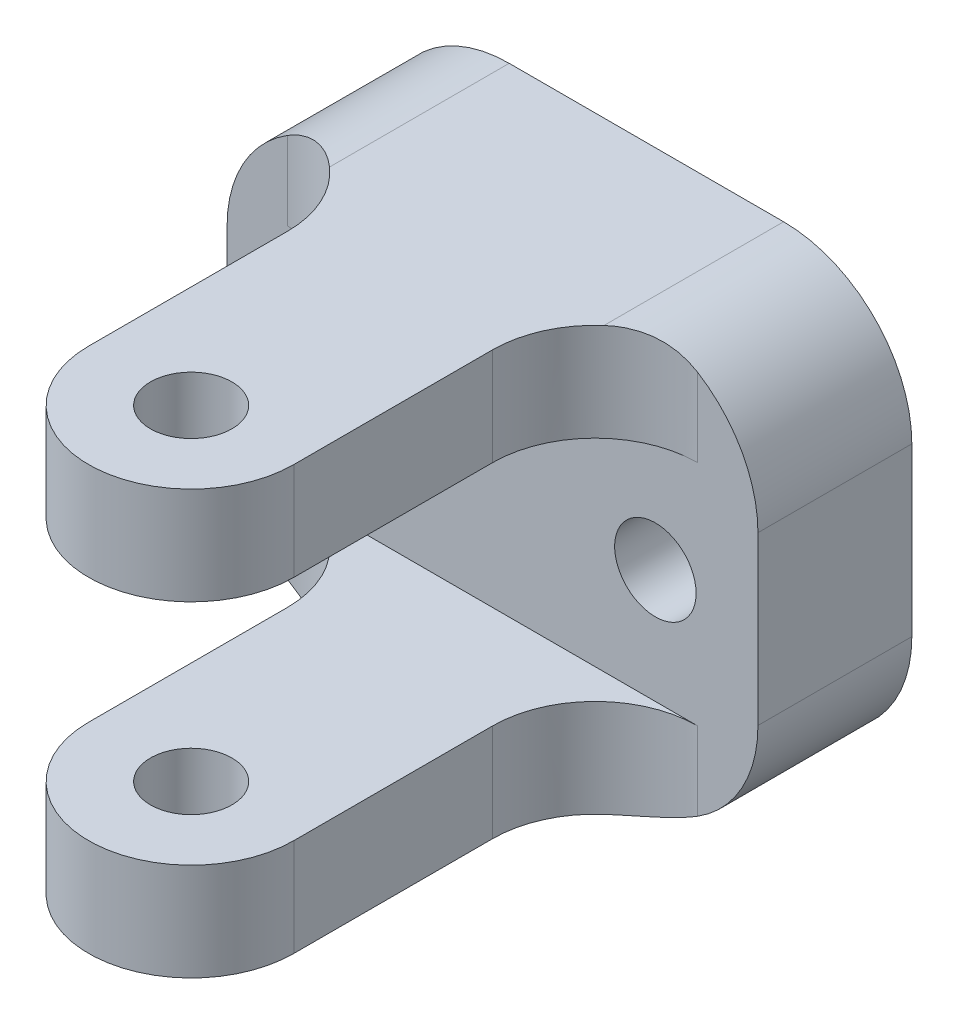
ISO-10303-21;
HEADER;
FILE_DESCRIPTION(('STEP AP214'),'2;1');
FILE_NAME('part.step','',(''),(''),'','','');
FILE_SCHEMA(('AUTOMOTIVE_DESIGN { 1 0 10303 214 1 1 1 1 }'));
ENDSEC;
DATA;
#1=APPLICATION_CONTEXT('core data for automotive mechanical design processes');
#2=APPLICATION_PROTOCOL_DEFINITION('international standard','automotive_design',2000,#1);
#3=PRODUCT_CONTEXT('',#1,'mechanical');
#4=PRODUCT('Part','Part','',(#3));
#5=PRODUCT_RELATED_PRODUCT_CATEGORY('part','',(#4));
#6=PRODUCT_DEFINITION_FORMATION('','',#4);
#7=PRODUCT_DEFINITION_CONTEXT('part definition',#1,'design');
#8=PRODUCT_DEFINITION('design','',#6,#7);
#9=PRODUCT_DEFINITION_SHAPE('','',#8);
#10=(LENGTH_UNIT() NAMED_UNIT(*) SI_UNIT(.MILLI.,.METRE.));
#11=(NAMED_UNIT(*) PLANE_ANGLE_UNIT() SI_UNIT($,.RADIAN.));
#12=(NAMED_UNIT(*) SI_UNIT($,.STERADIAN.) SOLID_ANGLE_UNIT());
#13=UNCERTAINTY_MEASURE_WITH_UNIT(LENGTH_MEASURE(1.E-05),#10,'distance_accuracy_value','');
#14=(GEOMETRIC_REPRESENTATION_CONTEXT(3) GLOBAL_UNCERTAINTY_ASSIGNED_CONTEXT((#13)) GLOBAL_UNIT_ASSIGNED_CONTEXT((#10,
#11,#12)) REPRESENTATION_CONTEXT('',''));
#15=CARTESIAN_POINT('',(0.,0.,0.));
#16=DIRECTION('',(0.,0.,1.));
#17=DIRECTION('',(1.,0.,0.));
#18=AXIS2_PLACEMENT_3D('',#15,#16,#17);
#19=CARTESIAN_POINT('',(0.,0.,12.));
#20=DIRECTION('',(0.,0.,-1.));
#21=DIRECTION('',(-1.,0.,0.));
#22=AXIS2_PLACEMENT_3D('',#19,#20,#21);
#23=PLANE('',#22);
#24=DIRECTION('',(0.,-1.,0.));
#25=VECTOR('',#24,1.);
#26=CARTESIAN_POINT('',(-20.7,-16.51,12.));
#27=LINE('',#26,#25);
#28=CARTESIAN_POINT('',(-20.7,6.51,12.));
#29=VERTEX_POINT('',#28);
#30=CARTESIAN_POINT('',(-20.7,-6.51,12.));
#31=VERTEX_POINT('',#30);
#32=EDGE_CURVE('E320',#29,#31,#27,.T.);
#33=ORIENTED_EDGE('',*,*,#32,.T.);
#34=CARTESIAN_POINT('',(-10.7,-6.51,12.));
#35=DIRECTION('',(0.,0.,-1.));
#36=DIRECTION('',(-1.,0.,0.));
#37=AXIS2_PLACEMENT_3D('',#34,#35,#36);
#38=CIRCLE('',#37,10.);
#39=CARTESIAN_POINT('',(-16.,-14.9899764150615,12.));
#40=VERTEX_POINT('',#39);
#41=EDGE_CURVE('E396',#31,#40,#38,.F.);
#42=ORIENTED_EDGE('',*,*,#41,.T.);
#43=DIRECTION('',(0.,1.,0.));
#44=VECTOR('',#43,1.);
#45=CARTESIAN_POINT('',(-16.,-83.7629553253982,12.));
#46=LINE('',#45,#44);
#47=CARTESIAN_POINT('',(-16.,-8.89,12.));
#48=VERTEX_POINT('',#47);
#49=EDGE_CURVE('E228',#40,#48,#46,.T.);
#50=ORIENTED_EDGE('',*,*,#49,.T.);
#51=DIRECTION('',(-1.,0.,0.));
#52=VECTOR('',#51,1.);
#53=CARTESIAN_POINT('',(-20.7,-8.89,12.));
#54=LINE('',#53,#52);
#55=CARTESIAN_POINT('',(16.,-8.88999999999998,12.));
#56=VERTEX_POINT('',#55);
#57=EDGE_CURVE('E291',#56,#48,#54,.T.);
#58=ORIENTED_EDGE('',*,*,#57,.F.);
#59=DIRECTION('',(0.,1.,0.));
#60=VECTOR('',#59,1.);
#61=CARTESIAN_POINT('',(16.,-83.7629553253982,12.));
#62=LINE('',#61,#60);
#63=CARTESIAN_POINT('',(16.,-14.9899764150615,12.));
#64=VERTEX_POINT('',#63);
#65=EDGE_CURVE('E259',#64,#56,#62,.T.);
#66=ORIENTED_EDGE('',*,*,#65,.F.);
#67=CARTESIAN_POINT('',(10.7,-6.51,12.));
#68=DIRECTION('',(0.,0.,-1.));
#69=DIRECTION('',(-1.,0.,0.));
#70=AXIS2_PLACEMENT_3D('',#67,#68,#69);
#71=CIRCLE('',#70,10.);
#72=CARTESIAN_POINT('',(20.7,-6.51,12.));
#73=VERTEX_POINT('',#72);
#74=EDGE_CURVE('E390',#64,#73,#71,.F.);
#75=ORIENTED_EDGE('',*,*,#74,.T.);
#76=DIRECTION('',(0.,1.,0.));
#77=VECTOR('',#76,1.);
#78=CARTESIAN_POINT('',(20.7,-16.51,12.));
#79=LINE('',#78,#77);
#80=CARTESIAN_POINT('',(20.7,6.51,12.));
#81=VERTEX_POINT('',#80);
#82=EDGE_CURVE('E316',#73,#81,#79,.T.);
#83=ORIENTED_EDGE('',*,*,#82,.T.);
#84=CARTESIAN_POINT('',(10.7,6.51,12.));
#85=DIRECTION('',(0.,0.,-1.));
#86=DIRECTION('',(-1.,0.,0.));
#87=AXIS2_PLACEMENT_3D('',#84,#85,#86);
#88=CIRCLE('',#87,10.);
#89=CARTESIAN_POINT('',(16.,14.9899764150615,12.));
#90=VERTEX_POINT('',#89);
#91=EDGE_CURVE('E387',#81,#90,#88,.F.);
#92=ORIENTED_EDGE('',*,*,#91,.T.);
#93=CARTESIAN_POINT('',(16.,8.89,12.));
#94=VERTEX_POINT('',#93);
#95=EDGE_CURVE('E222',#94,#90,#62,.T.);
#96=ORIENTED_EDGE('',*,*,#95,.F.);
#97=DIRECTION('',(1.,0.,0.));
#98=VECTOR('',#97,1.);
#99=CARTESIAN_POINT('',(-20.7,8.89,12.));
#100=LINE('',#99,#98);
#101=CARTESIAN_POINT('',(-16.,8.89,12.));
#102=VERTEX_POINT('',#101);
#103=EDGE_CURVE('E295',#102,#94,#100,.T.);
#104=ORIENTED_EDGE('',*,*,#103,.F.);
#105=CARTESIAN_POINT('',(-16.,14.9899764150615,12.));
#106=VERTEX_POINT('',#105);
#107=EDGE_CURVE('E242',#102,#106,#46,.T.);
#108=ORIENTED_EDGE('',*,*,#107,.T.);
#109=CARTESIAN_POINT('',(-10.7,6.51,12.));
#110=DIRECTION('',(0.,0.,-1.));
#111=DIRECTION('',(-1.,0.,0.));
#112=AXIS2_PLACEMENT_3D('',#109,#110,#111);
#113=CIRCLE('',#112,10.);
#114=EDGE_CURVE('E393',#106,#29,#113,.F.);
#115=ORIENTED_EDGE('',*,*,#114,.T.);
#116=EDGE_LOOP('',(#33,#42,#50,#58,#66,#75,#83,#92,#96,#104,#108,#115));
#117=FACE_BOUND('',#116,.T.);
#118=CARTESIAN_POINT('',(-12.7,0.,12.));
#119=DIRECTION('',(0.,0.,1.));
#120=DIRECTION('',(1.,0.,0.));
#121=AXIS2_PLACEMENT_3D('',#118,#119,#120);
#122=CIRCLE('',#121,3.175);
#123=CARTESIAN_POINT('',(-9.525,0.,12.));
#124=VERTEX_POINT('',#123);
#125=EDGE_CURVE('E300',#124,#124,#122,.T.);
#126=ORIENTED_EDGE('',*,*,#125,.F.);
#127=EDGE_LOOP('',(#126));
#128=FACE_BOUND('',#127,.T.);
#129=CARTESIAN_POINT('',(12.7,0.,12.));
#130=DIRECTION('',(0.,0.,1.));
#131=DIRECTION('',(1.,0.,0.));
#132=AXIS2_PLACEMENT_3D('',#129,#130,#131);
#133=CIRCLE('',#132,3.175);
#134=CARTESIAN_POINT('',(15.875,0.,12.));
#135=VERTEX_POINT('',#134);
#136=EDGE_CURVE('E308',#135,#135,#133,.T.);
#137=ORIENTED_EDGE('',*,*,#136,.F.);
#138=EDGE_LOOP('',(#137));
#139=FACE_BOUND('',#138,.T.);
#140=ADVANCED_FACE('F41',(#117,#128,#139),#23,.F.);
#141=CARTESIAN_POINT('',(0.,0.,0.));
#142=DIRECTION('',(0.,0.,-1.));
#143=DIRECTION('',(-1.,0.,0.));
#144=AXIS2_PLACEMENT_3D('',#141,#142,#143);
#145=PLANE('',#144);
#146=CARTESIAN_POINT('',(12.7,0.,0.));
#147=DIRECTION('',(0.,0.,1.));
#148=DIRECTION('',(1.,0.,0.));
#149=AXIS2_PLACEMENT_3D('',#146,#147,#148);
#150=CIRCLE('',#149,3.175);
#151=CARTESIAN_POINT('',(15.875,0.,0.));
#152=VERTEX_POINT('',#151);
#153=EDGE_CURVE('E304',#152,#152,#150,.T.);
#154=ORIENTED_EDGE('',*,*,#153,.T.);
#155=EDGE_LOOP('',(#154));
#156=FACE_BOUND('',#155,.T.);
#157=DIRECTION('',(1.,0.,0.));
#158=VECTOR('',#157,1.);
#159=CARTESIAN_POINT('',(-20.7,-16.51,0.));
#160=LINE('',#159,#158);
#161=CARTESIAN_POINT('',(-10.7,-16.51,0.));
#162=VERTEX_POINT('',#161);
#163=CARTESIAN_POINT('',(10.7,-16.51,0.));
#164=VERTEX_POINT('',#163);
#165=EDGE_CURVE('E321',#162,#164,#160,.T.);
#166=ORIENTED_EDGE('',*,*,#165,.F.);
#167=CARTESIAN_POINT('',(-10.7,-6.51,0.));
#168=DIRECTION('',(0.,0.,-1.));
#169=DIRECTION('',(-1.,0.,0.));
#170=AXIS2_PLACEMENT_3D('',#167,#168,#169);
#171=CIRCLE('',#170,10.);
#172=CARTESIAN_POINT('',(-20.7,-6.51,0.));
#173=VERTEX_POINT('',#172);
#174=EDGE_CURVE('E377',#162,#173,#171,.T.);
#175=ORIENTED_EDGE('',*,*,#174,.T.);
#176=DIRECTION('',(0.,-1.,0.));
#177=VECTOR('',#176,1.);
#178=CARTESIAN_POINT('',(-20.7,-16.51,0.));
#179=LINE('',#178,#177);
#180=CARTESIAN_POINT('',(-20.7,6.51,0.));
#181=VERTEX_POINT('',#180);
#182=EDGE_CURVE('E332',#181,#173,#179,.T.);
#183=ORIENTED_EDGE('',*,*,#182,.F.);
#184=CARTESIAN_POINT('',(-10.7,6.51,0.));
#185=DIRECTION('',(0.,0.,-1.));
#186=DIRECTION('',(-1.,0.,0.));
#187=AXIS2_PLACEMENT_3D('',#184,#185,#186);
#188=CIRCLE('',#187,10.);
#189=CARTESIAN_POINT('',(-10.7,16.51,0.));
#190=VERTEX_POINT('',#189);
#191=EDGE_CURVE('E374',#181,#190,#188,.T.);
#192=ORIENTED_EDGE('',*,*,#191,.T.);
#193=DIRECTION('',(-1.,0.,0.));
#194=VECTOR('',#193,1.);
#195=CARTESIAN_POINT('',(-20.7,16.51,0.));
#196=LINE('',#195,#194);
#197=CARTESIAN_POINT('',(10.7,16.51,0.));
#198=VERTEX_POINT('',#197);
#199=EDGE_CURVE('E329',#198,#190,#196,.T.);
#200=ORIENTED_EDGE('',*,*,#199,.F.);
#201=CARTESIAN_POINT('',(10.7,6.51,0.));
#202=DIRECTION('',(0.,0.,-1.));
#203=DIRECTION('',(-1.,0.,0.));
#204=AXIS2_PLACEMENT_3D('',#201,#202,#203);
#205=CIRCLE('',#204,10.);
#206=CARTESIAN_POINT('',(20.7,6.51,0.));
#207=VERTEX_POINT('',#206);
#208=EDGE_CURVE('E368',#198,#207,#205,.T.);
#209=ORIENTED_EDGE('',*,*,#208,.T.);
#210=DIRECTION('',(0.,1.,0.));
#211=VECTOR('',#210,1.);
#212=CARTESIAN_POINT('',(20.7,-16.51,0.));
#213=LINE('',#212,#211);
#214=CARTESIAN_POINT('',(20.7,-6.51,0.));
#215=VERTEX_POINT('',#214);
#216=EDGE_CURVE('E312',#215,#207,#213,.T.);
#217=ORIENTED_EDGE('',*,*,#216,.F.);
#218=CARTESIAN_POINT('',(10.7,-6.51,0.));
#219=DIRECTION('',(0.,0.,-1.));
#220=DIRECTION('',(-1.,0.,0.));
#221=AXIS2_PLACEMENT_3D('',#218,#219,#220);
#222=CIRCLE('',#221,10.);
#223=EDGE_CURVE('E371',#215,#164,#222,.T.);
#224=ORIENTED_EDGE('',*,*,#223,.T.);
#225=EDGE_LOOP('',(#166,#175,#183,#192,#200,#209,#217,#224));
#226=FACE_BOUND('',#225,.T.);
#227=CARTESIAN_POINT('',(-12.7,0.,0.));
#228=DIRECTION('',(0.,0.,1.));
#229=DIRECTION('',(1.,0.,0.));
#230=AXIS2_PLACEMENT_3D('',#227,#228,#229);
#231=CIRCLE('',#230,3.175);
#232=CARTESIAN_POINT('',(-9.525,0.,0.));
#233=VERTEX_POINT('',#232);
#234=EDGE_CURVE('E299',#233,#233,#231,.T.);
#235=ORIENTED_EDGE('',*,*,#234,.T.);
#236=EDGE_LOOP('',(#235));
#237=FACE_BOUND('',#236,.T.);
#238=ADVANCED_FACE('F476',(#156,#226,#237),#145,.T.);
#239=CARTESIAN_POINT('',(20.7,-16.51,12.));
#240=DIRECTION('',(-1.,0.,0.));
#241=DIRECTION('',(0.,0.,1.));
#242=AXIS2_PLACEMENT_3D('',#239,#240,#241);
#243=PLANE('',#242);
#244=ORIENTED_EDGE('',*,*,#82,.F.);
#245=DIRECTION('',(0.,0.,-1.));
#246=VECTOR('',#245,1.);
#247=CARTESIAN_POINT('',(20.7,-6.51,12.));
#248=LINE('',#247,#246);
#249=EDGE_CURVE('E443',#73,#215,#248,.T.);
#250=ORIENTED_EDGE('',*,*,#249,.T.);
#251=ORIENTED_EDGE('',*,*,#216,.T.);
#252=DIRECTION('',(0.,0.,-1.));
#253=VECTOR('',#252,1.);
#254=CARTESIAN_POINT('',(20.7,6.51,12.));
#255=LINE('',#254,#253);
#256=EDGE_CURVE('E428',#207,#81,#255,.F.);
#257=ORIENTED_EDGE('',*,*,#256,.T.);
#258=EDGE_LOOP('',(#244,#250,#251,#257));
#259=FACE_BOUND('',#258,.T.);
#260=ADVANCED_FACE('F480',(#259),#243,.F.);
#261=CARTESIAN_POINT('',(-20.7,16.51,12.));
#262=DIRECTION('',(0.,-1.,0.));
#263=DIRECTION('',(0.,0.,-1.));
#264=AXIS2_PLACEMENT_3D('',#261,#262,#263);
#265=PLANE('',#264);
#266=CARTESIAN_POINT('',(0.,16.51,35.5));
#267=DIRECTION('',(0.,-1.,0.));
#268=DIRECTION('',(0.,0.,-1.));
#269=AXIS2_PLACEMENT_3D('',#266,#267,#268);
#270=CIRCLE('',#269,3.175);
#271=CARTESIAN_POINT('',(0.,16.51,38.675));
#272=VERTEX_POINT('',#271);
#273=EDGE_CURVE('E278',#272,#272,#270,.T.);
#274=ORIENTED_EDGE('',*,*,#273,.T.);
#275=EDGE_LOOP('',(#274));
#276=FACE_BOUND('',#275,.T.);
#277=ORIENTED_EDGE('',*,*,#199,.T.);
#278=DIRECTION('',(0.,0.,-1.));
#279=VECTOR('',#278,1.);
#280=CARTESIAN_POINT('',(-10.7,16.51,12.));
#281=LINE('',#280,#279);
#282=CARTESIAN_POINT('',(-10.7,16.51,14.0075046933686));
#283=VERTEX_POINT('',#282);
#284=EDGE_CURVE('E69',#190,#283,#281,.F.);
#285=ORIENTED_EDGE('',*,*,#284,.T.);
#286=CARTESIAN_POINT('',(-16.,16.51,20.));
#287=DIRECTION('',(0.,-1.,0.));
#288=DIRECTION('',(0.,0.,-1.));
#289=AXIS2_PLACEMENT_3D('',#286,#287,#288);
#290=CIRCLE('',#289,8.);
#291=CARTESIAN_POINT('',(-8.,16.51,20.));
#292=VERTEX_POINT('',#291);
#293=EDGE_CURVE('E184',#283,#292,#290,.T.);
#294=ORIENTED_EDGE('',*,*,#293,.T.);
#295=DIRECTION('',(0.,0.,1.));
#296=VECTOR('',#295,1.);
#297=CARTESIAN_POINT('',(-8.,16.51,35.5));
#298=LINE('',#297,#296);
#299=CARTESIAN_POINT('',(-8.,16.51,35.5));
#300=VERTEX_POINT('',#299);
#301=EDGE_CURVE('E189',#292,#300,#298,.T.);
#302=ORIENTED_EDGE('',*,*,#301,.T.);
#303=CARTESIAN_POINT('',(0.,16.51,35.5));
#304=DIRECTION('',(0.,-1.,0.));
#305=DIRECTION('',(0.,0.,-1.));
#306=AXIS2_PLACEMENT_3D('',#303,#304,#305);
#307=CIRCLE('',#306,8.);
#308=CARTESIAN_POINT('',(8.,16.51,35.5));
#309=VERTEX_POINT('',#308);
#310=EDGE_CURVE('E210',#300,#309,#307,.F.);
#311=ORIENTED_EDGE('',*,*,#310,.T.);
#312=DIRECTION('',(0.,0.,-1.));
#313=VECTOR('',#312,1.);
#314=CARTESIAN_POINT('',(8.,16.51,35.5));
#315=LINE('',#314,#313);
#316=CARTESIAN_POINT('',(8.,16.51,20.));
#317=VERTEX_POINT('',#316);
#318=EDGE_CURVE('E213',#309,#317,#315,.T.);
#319=ORIENTED_EDGE('',*,*,#318,.T.);
#320=CARTESIAN_POINT('',(16.,16.51,20.));
#321=DIRECTION('',(0.,-1.,0.));
#322=DIRECTION('',(0.,0.,-1.));
#323=AXIS2_PLACEMENT_3D('',#320,#321,#322);
#324=CIRCLE('',#323,8.);
#325=CARTESIAN_POINT('',(10.7,16.51,14.0075046933686));
#326=VERTEX_POINT('',#325);
#327=EDGE_CURVE('E219',#317,#326,#324,.T.);
#328=ORIENTED_EDGE('',*,*,#327,.T.);
#329=DIRECTION('',(0.,0.,-1.));
#330=VECTOR('',#329,1.);
#331=CARTESIAN_POINT('',(10.7,16.51,12.));
#332=LINE('',#331,#330);
#333=EDGE_CURVE('E408',#326,#198,#332,.T.);
#334=ORIENTED_EDGE('',*,*,#333,.T.);
#335=EDGE_LOOP('',(#277,#285,#294,#302,#311,#319,#328,#334));
#336=FACE_BOUND('',#335,.T.);
#337=ADVANCED_FACE('F186',(#276,#336),#265,.F.);
#338=CARTESIAN_POINT('',(-20.7,-16.51,12.));
#339=DIRECTION('',(1.,0.,0.));
#340=DIRECTION('',(0.,0.,-1.));
#341=AXIS2_PLACEMENT_3D('',#338,#339,#340);
#342=PLANE('',#341);
#343=ORIENTED_EDGE('',*,*,#182,.T.);
#344=DIRECTION('',(0.,0.,-1.));
#345=VECTOR('',#344,1.);
#346=CARTESIAN_POINT('',(-20.7,-6.51,12.));
#347=LINE('',#346,#345);
#348=EDGE_CURVE('E384',#173,#31,#347,.F.);
#349=ORIENTED_EDGE('',*,*,#348,.T.);
#350=ORIENTED_EDGE('',*,*,#32,.F.);
#351=DIRECTION('',(0.,0.,-1.));
#352=VECTOR('',#351,1.);
#353=CARTESIAN_POINT('',(-20.7,6.51,12.));
#354=LINE('',#353,#352);
#355=EDGE_CURVE('E380',#29,#181,#354,.T.);
#356=ORIENTED_EDGE('',*,*,#355,.T.);
#357=EDGE_LOOP('',(#343,#349,#350,#356));
#358=FACE_BOUND('',#357,.T.);
#359=ADVANCED_FACE('F484',(#358),#342,.F.);
#360=CARTESIAN_POINT('',(-20.7,-16.51,12.));
#361=DIRECTION('',(0.,1.,0.));
#362=DIRECTION('',(0.,0.,1.));
#363=AXIS2_PLACEMENT_3D('',#360,#361,#362);
#364=PLANE('',#363);
#365=CARTESIAN_POINT('',(0.,-16.51,35.5));
#366=DIRECTION('',(0.,1.,0.));
#367=DIRECTION('',(0.,0.,1.));
#368=AXIS2_PLACEMENT_3D('',#365,#366,#367);
#369=CIRCLE('',#368,3.175);
#370=CARTESIAN_POINT('',(0.,-16.51,38.675));
#371=VERTEX_POINT('',#370);
#372=EDGE_CURVE('E282',#371,#371,#369,.F.);
#373=ORIENTED_EDGE('',*,*,#372,.F.);
#374=EDGE_LOOP('',(#373));
#375=FACE_BOUND('',#374,.T.);
#376=CARTESIAN_POINT('',(-16.,-16.51,20.));
#377=DIRECTION('',(0.,1.,0.));
#378=DIRECTION('',(0.,0.,1.));
#379=AXIS2_PLACEMENT_3D('',#376,#377,#378);
#380=CIRCLE('',#379,8.);
#381=CARTESIAN_POINT('',(-10.7,-16.51,14.0075046933686));
#382=VERTEX_POINT('',#381);
#383=CARTESIAN_POINT('',(-8.,-16.51,20.));
#384=VERTEX_POINT('',#383);
#385=EDGE_CURVE('E237',#382,#384,#380,.F.);
#386=ORIENTED_EDGE('',*,*,#385,.F.);
#387=DIRECTION('',(0.,0.,-1.));
#388=VECTOR('',#387,1.);
#389=CARTESIAN_POINT('',(-10.7,-16.51,12.));
#390=LINE('',#389,#388);
#391=EDGE_CURVE('E364',#382,#162,#390,.T.);
#392=ORIENTED_EDGE('',*,*,#391,.T.);
#393=ORIENTED_EDGE('',*,*,#165,.T.);
#394=DIRECTION('',(0.,0.,-1.));
#395=VECTOR('',#394,1.);
#396=CARTESIAN_POINT('',(10.7,-16.51,12.));
#397=LINE('',#396,#395);
#398=CARTESIAN_POINT('',(10.7,-16.51,14.0075046933686));
#399=VERTEX_POINT('',#398);
#400=EDGE_CURVE('E361',#164,#399,#397,.F.);
#401=ORIENTED_EDGE('',*,*,#400,.T.);
#402=CARTESIAN_POINT('',(16.,-16.51,20.));
#403=DIRECTION('',(0.,1.,0.));
#404=DIRECTION('',(0.,0.,1.));
#405=AXIS2_PLACEMENT_3D('',#402,#403,#404);
#406=CIRCLE('',#405,8.);
#407=CARTESIAN_POINT('',(8.,-16.51,20.));
#408=VERTEX_POINT('',#407);
#409=EDGE_CURVE('E223',#408,#399,#406,.F.);
#410=ORIENTED_EDGE('',*,*,#409,.F.);
#411=DIRECTION('',(0.,0.,-1.));
#412=VECTOR('',#411,1.);
#413=CARTESIAN_POINT('',(8.,-16.51,35.5));
#414=LINE('',#413,#412);
#415=CARTESIAN_POINT('',(8.,-16.51,35.5));
#416=VERTEX_POINT('',#415);
#417=EDGE_CURVE('E227',#416,#408,#414,.T.);
#418=ORIENTED_EDGE('',*,*,#417,.F.);
#419=CARTESIAN_POINT('',(0.,-16.51,35.5));
#420=DIRECTION('',(0.,1.,0.));
#421=DIRECTION('',(0.,0.,1.));
#422=AXIS2_PLACEMENT_3D('',#419,#420,#421);
#423=CIRCLE('',#422,8.);
#424=CARTESIAN_POINT('',(-8.,-16.51,35.5));
#425=VERTEX_POINT('',#424);
#426=EDGE_CURVE('E231',#425,#416,#423,.T.);
#427=ORIENTED_EDGE('',*,*,#426,.F.);
#428=DIRECTION('',(0.,0.,1.));
#429=VECTOR('',#428,1.);
#430=CARTESIAN_POINT('',(-8.,-16.51,35.5));
#431=LINE('',#430,#429);
#432=EDGE_CURVE('E234',#384,#425,#431,.T.);
#433=ORIENTED_EDGE('',*,*,#432,.F.);
#434=EDGE_LOOP('',(#386,#392,#393,#401,#410,#418,#427,#433));
#435=FACE_BOUND('',#434,.T.);
#436=ADVANCED_FACE('F472',(#375,#435),#364,.F.);
#437=CARTESIAN_POINT('',(12.7,0.,12.));
#438=DIRECTION('',(0.,0.,-1.));
#439=DIRECTION('',(-1.,0.,0.));
#440=AXIS2_PLACEMENT_3D('',#437,#438,#439);
#441=CYLINDRICAL_SURFACE('',#440,3.175);
#442=ORIENTED_EDGE('',*,*,#136,.T.);
#443=EDGE_LOOP('',(#442));
#444=FACE_BOUND('',#443,.T.);
#445=ORIENTED_EDGE('',*,*,#153,.F.);
#446=EDGE_LOOP('',(#445));
#447=FACE_BOUND('',#446,.T.);
#448=ADVANCED_FACE('F468',(#444,#447),#441,.F.);
#449=CARTESIAN_POINT('',(-12.7,0.,12.));
#450=DIRECTION('',(0.,0.,-1.));
#451=DIRECTION('',(-1.,0.,0.));
#452=AXIS2_PLACEMENT_3D('',#449,#450,#451);
#453=CYLINDRICAL_SURFACE('',#452,3.175);
#454=ORIENTED_EDGE('',*,*,#125,.T.);
#455=EDGE_LOOP('',(#454));
#456=FACE_BOUND('',#455,.T.);
#457=ORIENTED_EDGE('',*,*,#234,.F.);
#458=EDGE_LOOP('',(#457));
#459=FACE_BOUND('',#458,.T.);
#460=ADVANCED_FACE('F464',(#456,#459),#453,.F.);
#461=CARTESIAN_POINT('',(-20.7,8.89,65.));
#462=DIRECTION('',(0.,1.,0.));
#463=DIRECTION('',(0.,0.,1.));
#464=AXIS2_PLACEMENT_3D('',#461,#462,#463);
#465=PLANE('',#464);
#466=CARTESIAN_POINT('',(0.,8.89,35.5));
#467=DIRECTION('',(0.,1.,0.));
#468=DIRECTION('',(0.,0.,1.));
#469=AXIS2_PLACEMENT_3D('',#466,#467,#468);
#470=CIRCLE('',#469,3.175);
#471=CARTESIAN_POINT('',(0.,8.89,38.675));
#472=VERTEX_POINT('',#471);
#473=EDGE_CURVE('E287',#472,#472,#470,.T.);
#474=ORIENTED_EDGE('',*,*,#473,.T.);
#475=EDGE_LOOP('',(#474));
#476=FACE_BOUND('',#475,.T.);
#477=DIRECTION('',(0.,0.,-1.));
#478=VECTOR('',#477,1.);
#479=CARTESIAN_POINT('',(-8.,8.89,65.));
#480=LINE('',#479,#478);
#481=CARTESIAN_POINT('',(-8.,8.89,35.5));
#482=VERTEX_POINT('',#481);
#483=CARTESIAN_POINT('',(-8.,8.89,20.));
#484=VERTEX_POINT('',#483);
#485=EDGE_CURVE('E273',#482,#484,#480,.T.);
#486=ORIENTED_EDGE('',*,*,#485,.T.);
#487=CARTESIAN_POINT('',(-16.,8.89,20.));
#488=DIRECTION('',(0.,1.,0.));
#489=DIRECTION('',(0.,0.,1.));
#490=AXIS2_PLACEMENT_3D('',#487,#488,#489);
#491=CIRCLE('',#490,8.);
#492=EDGE_CURVE('E198',#484,#102,#491,.T.);
#493=ORIENTED_EDGE('',*,*,#492,.T.);
#494=ORIENTED_EDGE('',*,*,#103,.T.);
#495=CARTESIAN_POINT('',(16.,8.89,20.));
#496=DIRECTION('',(0.,1.,0.));
#497=DIRECTION('',(0.,0.,1.));
#498=AXIS2_PLACEMENT_3D('',#495,#496,#497);
#499=CIRCLE('',#498,8.);
#500=CARTESIAN_POINT('',(8.,8.89,20.));
#501=VERTEX_POINT('',#500);
#502=EDGE_CURVE('E240',#94,#501,#499,.T.);
#503=ORIENTED_EDGE('',*,*,#502,.T.);
#504=DIRECTION('',(0.,0.,1.));
#505=VECTOR('',#504,1.);
#506=CARTESIAN_POINT('',(8.,8.89,65.));
#507=LINE('',#506,#505);
#508=CARTESIAN_POINT('',(8.,8.89,35.5));
#509=VERTEX_POINT('',#508);
#510=EDGE_CURVE('E265',#501,#509,#507,.T.);
#511=ORIENTED_EDGE('',*,*,#510,.T.);
#512=CARTESIAN_POINT('',(0.,8.89,35.5));
#513=DIRECTION('',(0.,1.,0.));
#514=DIRECTION('',(0.,0.,1.));
#515=AXIS2_PLACEMENT_3D('',#512,#513,#514);
#516=CIRCLE('',#515,8.);
#517=EDGE_CURVE('E269',#509,#482,#516,.F.);
#518=ORIENTED_EDGE('',*,*,#517,.T.);
#519=EDGE_LOOP('',(#486,#493,#494,#503,#511,#518));
#520=FACE_BOUND('',#519,.T.);
#521=ADVANCED_FACE('F460',(#476,#520),#465,.F.);
#522=CARTESIAN_POINT('',(-20.7,-8.89,65.));
#523=DIRECTION('',(0.,-1.,0.));
#524=DIRECTION('',(1.,0.,0.));
#525=AXIS2_PLACEMENT_3D('',#522,#523,#524);
#526=PLANE('',#525);
#527=CARTESIAN_POINT('',(0.,-8.88999999999999,35.5));
#528=DIRECTION('',(0.,-1.,0.));
#529=DIRECTION('',(1.,0.,0.));
#530=AXIS2_PLACEMENT_3D('',#527,#528,#529);
#531=CIRCLE('',#530,3.175);
#532=CARTESIAN_POINT('',(0.,-8.88999999999999,38.675));
#533=VERTEX_POINT('',#532);
#534=EDGE_CURVE('E286',#533,#533,#531,.T.);
#535=ORIENTED_EDGE('',*,*,#534,.T.);
#536=EDGE_LOOP('',(#535));
#537=FACE_BOUND('',#536,.T.);
#538=ORIENTED_EDGE('',*,*,#57,.T.);
#539=CARTESIAN_POINT('',(-16.,-8.89,20.));
#540=DIRECTION('',(0.,-1.,0.));
#541=DIRECTION('',(1.,0.,0.));
#542=AXIS2_PLACEMENT_3D('',#539,#540,#541);
#543=CIRCLE('',#542,8.);
#544=CARTESIAN_POINT('',(-8.,-8.89,20.));
#545=VERTEX_POINT('',#544);
#546=EDGE_CURVE('E357',#48,#545,#543,.T.);
#547=ORIENTED_EDGE('',*,*,#546,.T.);
#548=DIRECTION('',(0.,0.,1.));
#549=VECTOR('',#548,1.);
#550=CARTESIAN_POINT('',(-8.,-8.89,65.));
#551=LINE('',#550,#549);
#552=CARTESIAN_POINT('',(-8.,-8.88999999999998,35.5));
#553=VERTEX_POINT('',#552);
#554=EDGE_CURVE('E353',#545,#553,#551,.T.);
#555=ORIENTED_EDGE('',*,*,#554,.T.);
#556=CARTESIAN_POINT('',(0.,-8.88999999999998,35.5));
#557=DIRECTION('',(0.,-1.,0.));
#558=DIRECTION('',(1.,0.,0.));
#559=AXIS2_PLACEMENT_3D('',#556,#557,#558);
#560=CIRCLE('',#559,8.);
#561=CARTESIAN_POINT('',(8.,-8.88999999999998,35.5));
#562=VERTEX_POINT('',#561);
#563=EDGE_CURVE('E349',#553,#562,#560,.F.);
#564=ORIENTED_EDGE('',*,*,#563,.T.);
#565=DIRECTION('',(0.,0.,-1.));
#566=VECTOR('',#565,1.);
#567=CARTESIAN_POINT('',(8.,-8.88999999999999,65.));
#568=LINE('',#567,#566);
#569=CARTESIAN_POINT('',(8.,-8.88999999999998,20.));
#570=VERTEX_POINT('',#569);
#571=EDGE_CURVE('E345',#562,#570,#568,.T.);
#572=ORIENTED_EDGE('',*,*,#571,.T.);
#573=CARTESIAN_POINT('',(16.,-8.88999999999998,20.));
#574=DIRECTION('',(0.,-1.,0.));
#575=DIRECTION('',(1.,0.,0.));
#576=AXIS2_PLACEMENT_3D('',#573,#574,#575);
#577=CIRCLE('',#576,8.);
#578=EDGE_CURVE('E325',#570,#56,#577,.T.);
#579=ORIENTED_EDGE('',*,*,#578,.T.);
#580=EDGE_LOOP('',(#538,#547,#555,#564,#572,#579));
#581=FACE_BOUND('',#580,.T.);
#582=ADVANCED_FACE('F457',(#537,#581),#526,.F.);
#583=CARTESIAN_POINT('',(0.,-25.4902561210691,35.5));
#584=DIRECTION('',(0.,1.,0.));
#585=DIRECTION('',(0.,0.,1.));
#586=AXIS2_PLACEMENT_3D('',#583,#584,#585);
#587=CYLINDRICAL_SURFACE('',#586,3.175);
#588=CARTESIAN_POINT('',(0.,-16.51,38.675));
#589=CARTESIAN_POINT('',(0.,-16.430625,38.675));
#590=CARTESIAN_POINT('',(0.,-16.35125,38.675));
#591=CARTESIAN_POINT('',(0.,-16.1925,38.675));
#592=CARTESIAN_POINT('',(0.,-16.113125,38.675));
#593=CARTESIAN_POINT('',(0.,-15.954375,38.675));
#594=CARTESIAN_POINT('',(0.,-15.875,38.675));
#595=CARTESIAN_POINT('',(0.,-15.71625,38.675));
#596=CARTESIAN_POINT('',(0.,-15.636875,38.675));
#597=CARTESIAN_POINT('',(0.,-15.478125,38.675));
#598=CARTESIAN_POINT('',(0.,-15.39875,38.675));
#599=CARTESIAN_POINT('',(0.,-15.24,38.675));
#600=CARTESIAN_POINT('',(0.,-15.160625,38.675));
#601=CARTESIAN_POINT('',(0.,-15.001875,38.675));
#602=CARTESIAN_POINT('',(0.,-14.9225,38.675));
#603=CARTESIAN_POINT('',(0.,-14.76375,38.675));
#604=CARTESIAN_POINT('',(0.,-14.684375,38.675));
#605=CARTESIAN_POINT('',(0.,-14.525625,38.675));
#606=CARTESIAN_POINT('',(0.,-14.44625,38.675));
#607=CARTESIAN_POINT('',(0.,-14.2875,38.675));
#608=CARTESIAN_POINT('',(0.,-14.208125,38.675));
#609=CARTESIAN_POINT('',(0.,-14.049375,38.675));
#610=CARTESIAN_POINT('',(0.,-13.97,38.675));
#611=CARTESIAN_POINT('',(0.,-13.81125,38.675));
#612=CARTESIAN_POINT('',(0.,-13.731875,38.675));
#613=CARTESIAN_POINT('',(0.,-13.573125,38.675));
#614=CARTESIAN_POINT('',(0.,-13.49375,38.675));
#615=CARTESIAN_POINT('',(0.,-13.335,38.675));
#616=CARTESIAN_POINT('',(0.,-13.255625,38.675));
#617=CARTESIAN_POINT('',(0.,-13.096875,38.675));
#618=CARTESIAN_POINT('',(0.,-13.0175,38.675));
#619=CARTESIAN_POINT('',(0.,-12.85875,38.675));
#620=CARTESIAN_POINT('',(0.,-12.779375,38.675));
#621=CARTESIAN_POINT('',(0.,-12.620625,38.675));
#622=CARTESIAN_POINT('',(0.,-12.54125,38.675));
#623=CARTESIAN_POINT('',(0.,-12.3825,38.675));
#624=CARTESIAN_POINT('',(0.,-12.303125,38.675));
#625=CARTESIAN_POINT('',(0.,-12.144375,38.675));
#626=CARTESIAN_POINT('',(0.,-12.065,38.675));
#627=CARTESIAN_POINT('',(0.,-11.90625,38.675));
#628=CARTESIAN_POINT('',(0.,-11.826875,38.675));
#629=CARTESIAN_POINT('',(0.,-11.668125,38.675));
#630=CARTESIAN_POINT('',(0.,-11.58875,38.675));
#631=CARTESIAN_POINT('',(0.,-11.43,38.675));
#632=CARTESIAN_POINT('',(0.,-11.350625,38.675));
#633=CARTESIAN_POINT('',(0.,-11.191875,38.675));
#634=CARTESIAN_POINT('',(0.,-11.1125,38.675));
#635=CARTESIAN_POINT('',(0.,-10.95375,38.675));
#636=CARTESIAN_POINT('',(0.,-10.874375,38.675));
#637=CARTESIAN_POINT('',(0.,-10.715625,38.675));
#638=CARTESIAN_POINT('',(0.,-10.63625,38.675));
#639=CARTESIAN_POINT('',(0.,-10.4775,38.675));
#640=CARTESIAN_POINT('',(0.,-10.398125,38.675));
#641=CARTESIAN_POINT('',(0.,-10.239375,38.675));
#642=CARTESIAN_POINT('',(0.,-10.16,38.675));
#643=CARTESIAN_POINT('',(0.,-10.00125,38.675));
#644=CARTESIAN_POINT('',(0.,-9.92187499999999,38.675));
#645=CARTESIAN_POINT('',(0.,-9.76312499999999,38.675));
#646=CARTESIAN_POINT('',(0.,-9.68374999999999,38.675));
#647=CARTESIAN_POINT('',(0.,-9.52499999999999,38.675));
#648=CARTESIAN_POINT('',(0.,-9.44562499999999,38.675));
#649=CARTESIAN_POINT('',(0.,-9.28687499999999,38.675));
#650=CARTESIAN_POINT('',(0.,-9.20749999999999,38.675));
#651=CARTESIAN_POINT('',(0.,-9.04874999999999,38.675));
#652=CARTESIAN_POINT('',(0.,-8.96937499999999,38.675));
#653=CARTESIAN_POINT('',(0.,-8.88999999999999,38.675));
#654=B_SPLINE_CURVE_WITH_KNOTS('',3,(#588,#589,#590,#591,#592,#593,#594,#595,#596,#597,#598,
#599,#600,#601,#602,#603,#604,#605,#606,#607,#608,#609,#610,#611,#612,#613,#614,#615,#616,#617,
#618,#619,#620,#621,#622,#623,#624,#625,#626,#627,#628,#629,#630,#631,#632,#633,#634,#635,#636,
#637,#638,#639,#640,#641,#642,#643,#644,#645,#646,#647,#648,#649,#650,#651,#652,#653),
.UNSPECIFIED.,.F.,.F.,(4,2,2,2,2,2,2,2,2,2,2,2,2,2,2,2,2,2,2,2,2,2,2,2,2,2,2,2,2,2,2,2,4),(0.,
0.238125000000002,0.476250000000004,0.714375000000003,0.952500000000004,1.190625,1.42875,
1.66687500000001,1.90500000000001,2.14312500000001,2.38125000000001,2.61937500000001,
2.85750000000001,3.09562500000001,3.33375000000001,3.57187500000001,3.81000000000001,
4.04812500000001,4.28625000000001,4.52437500000001,4.76250000000001,5.00062500000001,
5.23875000000001,5.47687500000001,5.71500000000001,5.95312500000001,6.19125000000001,
6.42937500000001,6.66750000000001,6.90562500000001,7.14375000000001,7.38187500000002,
7.62000000000002),.UNSPECIFIED.);
#655=EDGE_CURVE('BSEAM455',#371,#533,#654,.T.);
#656=ORIENTED_EDGE('',*,*,#372,.T.);
#657=ORIENTED_EDGE('',*,*,#534,.F.);
#658=ORIENTED_EDGE('',*,*,#655,.T.);
#659=ORIENTED_EDGE('',*,*,#655,.F.);
#660=EDGE_LOOP('',(#656,#658,#657,#659));
#661=FACE_BOUND('',#660,.T.);
#662=ADVANCED_FACE('F455',(#661),#587,.F.);
#663=CARTESIAN_POINT('',(0.,16.51,38.675));
#664=CARTESIAN_POINT('',(0.,16.430625,38.675));
#665=CARTESIAN_POINT('',(0.,16.35125,38.675));
#666=CARTESIAN_POINT('',(0.,16.1925,38.675));
#667=CARTESIAN_POINT('',(0.,16.113125,38.675));
#668=CARTESIAN_POINT('',(0.,15.954375,38.675));
#669=CARTESIAN_POINT('',(0.,15.875,38.675));
#670=CARTESIAN_POINT('',(0.,15.71625,38.675));
#671=CARTESIAN_POINT('',(0.,15.636875,38.675));
#672=CARTESIAN_POINT('',(0.,15.478125,38.675));
#673=CARTESIAN_POINT('',(0.,15.39875,38.675));
#674=CARTESIAN_POINT('',(0.,15.24,38.675));
#675=CARTESIAN_POINT('',(0.,15.160625,38.675));
#676=CARTESIAN_POINT('',(0.,15.001875,38.675));
#677=CARTESIAN_POINT('',(0.,14.9225,38.675));
#678=CARTESIAN_POINT('',(0.,14.76375,38.675));
#679=CARTESIAN_POINT('',(0.,14.684375,38.675));
#680=CARTESIAN_POINT('',(0.,14.525625,38.675));
#681=CARTESIAN_POINT('',(0.,14.44625,38.675));
#682=CARTESIAN_POINT('',(0.,14.2875,38.675));
#683=CARTESIAN_POINT('',(0.,14.208125,38.675));
#684=CARTESIAN_POINT('',(0.,14.049375,38.675));
#685=CARTESIAN_POINT('',(0.,13.97,38.675));
#686=CARTESIAN_POINT('',(0.,13.81125,38.675));
#687=CARTESIAN_POINT('',(0.,13.731875,38.675));
#688=CARTESIAN_POINT('',(0.,13.573125,38.675));
#689=CARTESIAN_POINT('',(0.,13.49375,38.675));
#690=CARTESIAN_POINT('',(0.,13.335,38.675));
#691=CARTESIAN_POINT('',(0.,13.255625,38.675));
#692=CARTESIAN_POINT('',(0.,13.096875,38.675));
#693=CARTESIAN_POINT('',(0.,13.0175,38.675));
#694=CARTESIAN_POINT('',(0.,12.85875,38.675));
#695=CARTESIAN_POINT('',(0.,12.779375,38.675));
#696=CARTESIAN_POINT('',(0.,12.620625,38.675));
#697=CARTESIAN_POINT('',(0.,12.54125,38.675));
#698=CARTESIAN_POINT('',(0.,12.3825,38.675));
#699=CARTESIAN_POINT('',(0.,12.303125,38.675));
#700=CARTESIAN_POINT('',(0.,12.144375,38.675));
#701=CARTESIAN_POINT('',(0.,12.065,38.675));
#702=CARTESIAN_POINT('',(0.,11.90625,38.675));
#703=CARTESIAN_POINT('',(0.,11.826875,38.675));
#704=CARTESIAN_POINT('',(0.,11.668125,38.675));
#705=CARTESIAN_POINT('',(0.,11.58875,38.675));
#706=CARTESIAN_POINT('',(0.,11.43,38.675));
#707=CARTESIAN_POINT('',(0.,11.350625,38.675));
#708=CARTESIAN_POINT('',(0.,11.191875,38.675));
#709=CARTESIAN_POINT('',(0.,11.1125,38.675));
#710=CARTESIAN_POINT('',(0.,10.95375,38.675));
#711=CARTESIAN_POINT('',(0.,10.874375,38.675));
#712=CARTESIAN_POINT('',(0.,10.715625,38.675));
#713=CARTESIAN_POINT('',(0.,10.63625,38.675));
#714=CARTESIAN_POINT('',(0.,10.4775,38.675));
#715=CARTESIAN_POINT('',(0.,10.398125,38.675));
#716=CARTESIAN_POINT('',(0.,10.239375,38.675));
#717=CARTESIAN_POINT('',(0.,10.16,38.675));
#718=CARTESIAN_POINT('',(0.,10.00125,38.675));
#719=CARTESIAN_POINT('',(0.,9.921875,38.675));
#720=CARTESIAN_POINT('',(0.,9.763125,38.675));
#721=CARTESIAN_POINT('',(0.,9.68375,38.675));
#722=CARTESIAN_POINT('',(0.,9.525,38.675));
#723=CARTESIAN_POINT('',(0.,9.445625,38.675));
#724=CARTESIAN_POINT('',(0.,9.286875,38.675));
#725=CARTESIAN_POINT('',(0.,9.2075,38.675));
#726=CARTESIAN_POINT('',(0.,9.04875,38.675));
#727=CARTESIAN_POINT('',(0.,8.969375,38.675));
#728=CARTESIAN_POINT('',(0.,8.89,38.675));
#729=B_SPLINE_CURVE_WITH_KNOTS('',3,(#663,#664,#665,#666,#667,#668,#669,#670,#671,#672,#673,
#674,#675,#676,#677,#678,#679,#680,#681,#682,#683,#684,#685,#686,#687,#688,#689,#690,#691,#692,
#693,#694,#695,#696,#697,#698,#699,#700,#701,#702,#703,#704,#705,#706,#707,#708,#709,#710,#711,
#712,#713,#714,#715,#716,#717,#718,#719,#720,#721,#722,#723,#724,#725,#726,#727,#728),
.UNSPECIFIED.,.F.,.F.,(4,2,2,2,2,2,2,2,2,2,2,2,2,2,2,2,2,2,2,2,2,2,2,2,2,2,2,2,2,2,2,2,4),(0.,
0.238124999999999,0.476249999999998,0.714375000000003,0.952500000000002,1.190625,1.42875,
1.666875,1.905,2.143125,2.38125,2.619375,2.8575,3.095625,3.33375,3.571875,3.81,4.048125,4.28625,
4.524375,4.7625,5.000625,5.23875,5.476875,5.715,5.953125,6.19125,6.429375,6.6675,6.905625,
7.14375,7.381875,7.62),.UNSPECIFIED.);
#730=EDGE_CURVE('BSEAM451',#272,#472,#729,.T.);
#731=ORIENTED_EDGE('',*,*,#273,.F.);
#732=ORIENTED_EDGE('',*,*,#473,.F.);
#733=ORIENTED_EDGE('',*,*,#730,.T.);
#734=ORIENTED_EDGE('',*,*,#730,.F.);
#735=EDGE_LOOP('',(#731,#733,#732,#734));
#736=FACE_BOUND('',#735,.T.);
#737=ADVANCED_FACE('F451',(#736),#587,.F.);
#738=CARTESIAN_POINT('',(16.,-83.7629553253982,20.));
#739=DIRECTION('',(0.,1.,0.));
#740=DIRECTION('',(0.,0.,1.));
#741=AXIS2_PLACEMENT_3D('',#738,#739,#740);
#742=CYLINDRICAL_SURFACE('',#741,8.);
#743=ORIENTED_EDGE('',*,*,#409,.T.);
#744=CARTESIAN_POINT('',(10.7,-16.51,14.0075046933686));
#745=CARTESIAN_POINT('',(10.8420212354178,-16.5100147874579,13.88185654106));
#746=CARTESIAN_POINT('',(10.9885756153321,-16.506974943152,13.7612762836237));
#747=CARTESIAN_POINT('',(11.2897261642043,-16.4937303977113,13.5309078692278));
#748=CARTESIAN_POINT('',(11.444325955119,-16.4835224432789,13.421124638378));
#749=CARTESIAN_POINT('',(11.76014169862,-16.4549086325032,13.2132997751098));
#750=CARTESIAN_POINT('',(11.9213458904065,-16.436516818773,13.1152383933734));
#751=CARTESIAN_POINT('',(12.2492576893319,-16.3906474360689,12.9312476513549));
#752=CARTESIAN_POINT('',(12.4159642123808,-16.3631716473483,12.8453159186412));
#753=CARTESIAN_POINT('',(12.7540905841086,-16.2982816400755,12.6856879501245));
#754=CARTESIAN_POINT('',(12.9255263650259,-16.2608288346017,12.6120410649571));
#755=CARTESIAN_POINT('',(13.2708434648524,-16.1755260359255,12.4776310764951));
#756=CARTESIAN_POINT('',(13.4447247652259,-16.1276761214871,12.4168678756064));
#757=CARTESIAN_POINT('',(13.7931468232219,-16.0213399363901,12.3082464289134));
#758=CARTESIAN_POINT('',(13.9676871349769,-15.9628599115421,12.260380645903));
#759=CARTESIAN_POINT('',(14.3157907533474,-15.8352585284856,12.1772460330403));
#760=CARTESIAN_POINT('',(14.4893542811913,-15.7661396893756,12.1419742276851));
#761=CARTESIAN_POINT('',(14.8913691136041,-15.5926685949841,12.073770018153));
#762=CARTESIAN_POINT('',(15.118889741493,-15.4842413893641,12.0455117141336));
#763=CARTESIAN_POINT('',(15.4542053567886,-15.3084946643696,12.0178497561665));
#764=CARTESIAN_POINT('',(15.5649578884548,-15.2477437886337,12.011083215825));
#765=CARTESIAN_POINT('',(15.7842254199699,-15.1220040912332,12.0021585876374));
#766=CARTESIAN_POINT('',(15.8927403716283,-15.0570151784197,12.0000005989425));
#767=CARTESIAN_POINT('',(16.,-14.9899764150615,12.));
#768=B_SPLINE_CURVE_WITH_KNOTS('',3,(#744,#745,#746,#747,#748,#749,#750,#751,#752,#753,#754,
#755,#756,#757,#758,#759,#760,#761,#762,#763,#764,#765,#766,#767),.UNSPECIFIED.,.F.,.F.,(4,2,2,
2,2,2,2,2,2,2,2,4),(0.,0.568785286299191,1.13782888681667,1.70589981318278,2.2738594764438,
2.844048490406,3.4142331850207,3.98408393941604,4.55379996939203,5.31287436127857,
5.69223476024513,6.07160332093357),.UNSPECIFIED.);
#769=EDGE_CURVE('E56',#399,#64,#768,.T.);
#770=ORIENTED_EDGE('',*,*,#769,.T.);
#771=ORIENTED_EDGE('',*,*,#65,.T.);
#772=ORIENTED_EDGE('',*,*,#578,.F.);
#773=DIRECTION('',(0.,1.,0.));
#774=VECTOR('',#773,1.);
#775=CARTESIAN_POINT('',(8.,-83.7629553253982,20.));
#776=LINE('',#775,#774);
#777=EDGE_CURVE('E254',#408,#570,#776,.T.);
#778=ORIENTED_EDGE('',*,*,#777,.F.);
#779=EDGE_LOOP('',(#743,#770,#771,#772,#778));
#780=FACE_BOUND('',#779,.T.);
#781=ADVANCED_FACE('F450',(#780),#742,.F.);
#782=CARTESIAN_POINT('',(8.,-83.7629553253982,35.5));
#783=DIRECTION('',(-1.,0.,0.));
#784=DIRECTION('',(0.,0.,1.));
#785=AXIS2_PLACEMENT_3D('',#782,#783,#784);
#786=PLANE('',#785);
#787=DIRECTION('',(0.,1.,0.));
#788=VECTOR('',#787,1.);
#789=CARTESIAN_POINT('',(8.,-83.7629553253982,35.5));
#790=LINE('',#789,#788);
#791=EDGE_CURVE('E249',#416,#562,#790,.T.);
#792=ORIENTED_EDGE('',*,*,#791,.F.);
#793=ORIENTED_EDGE('',*,*,#417,.T.);
#794=ORIENTED_EDGE('',*,*,#777,.T.);
#795=ORIENTED_EDGE('',*,*,#571,.F.);
#796=EDGE_LOOP('',(#792,#793,#794,#795));
#797=FACE_BOUND('',#796,.T.);
#798=ADVANCED_FACE('F556',(#797),#786,.F.);
#799=CARTESIAN_POINT('',(0.,-83.7629553253982,35.5));
#800=DIRECTION('',(0.,1.,0.));
#801=DIRECTION('',(0.,0.,1.));
#802=AXIS2_PLACEMENT_3D('',#799,#800,#801);
#803=CYLINDRICAL_SURFACE('',#802,8.);
#804=DIRECTION('',(0.,1.,0.));
#805=VECTOR('',#804,1.);
#806=CARTESIAN_POINT('',(-8.,-83.7629553253982,35.5));
#807=LINE('',#806,#805);
#808=EDGE_CURVE('E203',#425,#553,#807,.T.);
#809=ORIENTED_EDGE('',*,*,#808,.F.);
#810=ORIENTED_EDGE('',*,*,#426,.T.);
#811=ORIENTED_EDGE('',*,*,#791,.T.);
#812=ORIENTED_EDGE('',*,*,#563,.F.);
#813=EDGE_LOOP('',(#809,#810,#811,#812));
#814=FACE_BOUND('',#813,.T.);
#815=ADVANCED_FACE('F547',(#814),#803,.T.);
#816=CARTESIAN_POINT('',(-8.,-83.7629553253982,35.5));
#817=DIRECTION('',(1.,0.,0.));
#818=DIRECTION('',(0.,0.,-1.));
#819=AXIS2_PLACEMENT_3D('',#816,#817,#818);
#820=PLANE('',#819);
#821=DIRECTION('',(0.,1.,0.));
#822=VECTOR('',#821,1.);
#823=CARTESIAN_POINT('',(-8.,-83.7629553253982,20.));
#824=LINE('',#823,#822);
#825=EDGE_CURVE('E202',#384,#545,#824,.T.);
#826=ORIENTED_EDGE('',*,*,#825,.F.);
#827=ORIENTED_EDGE('',*,*,#432,.T.);
#828=ORIENTED_EDGE('',*,*,#808,.T.);
#829=ORIENTED_EDGE('',*,*,#554,.F.);
#830=EDGE_LOOP('',(#826,#827,#828,#829));
#831=FACE_BOUND('',#830,.T.);
#832=ADVANCED_FACE('F545',(#831),#820,.F.);
#833=CARTESIAN_POINT('',(-16.,-83.7629553253982,20.));
#834=DIRECTION('',(0.,1.,0.));
#835=DIRECTION('',(0.,0.,1.));
#836=AXIS2_PLACEMENT_3D('',#833,#834,#835);
#837=CYLINDRICAL_SURFACE('',#836,8.);
#838=ORIENTED_EDGE('',*,*,#49,.F.);
#839=CARTESIAN_POINT('',(-16.,-14.9899764150615,12.));
#840=CARTESIAN_POINT('',(-15.8392164042194,-15.0905066610901,11.9999761049006));
#841=CARTESIAN_POINT('',(-15.6754955624374,-15.1864331627538,12.0048470109547));
#842=CARTESIAN_POINT('',(-15.3433104535862,-15.3686337217787,12.0252670072906));
#843=CARTESIAN_POINT('',(-15.1748437345334,-15.4549026706351,12.0408217181784));
#844=CARTESIAN_POINT('',(-14.8348066785126,-15.617075607118,12.0834575558516));
#845=CARTESIAN_POINT('',(-14.6632431450107,-15.6929997734323,12.1105158059732));
#846=CARTESIAN_POINT('',(-14.3181900773887,-15.8343466139596,12.1768060447723));
#847=CARTESIAN_POINT('',(-14.1447009823046,-15.8997716314896,12.2160353112372));
#848=CARTESIAN_POINT('',(-13.7966337152378,-16.0202532615625,12.3072972025525));
#849=CARTESIAN_POINT('',(-13.6220539973326,-16.0752661681257,12.3593817712854));
#850=CARTESIAN_POINT('',(-13.2742071224522,-16.1746873863048,12.4764549005238));
#851=CARTESIAN_POINT('',(-13.1009399694575,-16.2190956657748,12.5414435001441));
#852=CARTESIAN_POINT('',(-12.7574789542526,-16.297634847592,12.6842212558915));
#853=CARTESIAN_POINT('',(-12.5872836055899,-16.331770853266,12.7620040259934));
#854=CARTESIAN_POINT('',(-12.2515367027412,-16.3903740776499,12.9300434506172));
#855=CARTESIAN_POINT('',(-12.0859840695777,-16.4148435604739,13.0202971774718));
#856=CARTESIAN_POINT('',(-11.7068112473646,-16.4615776434919,13.2448680299113));
#857=CARTESIAN_POINT('',(-11.4954995028608,-16.4804074331367,13.3838611997419));
#858=CARTESIAN_POINT('',(-11.188977059012,-16.4985638631748,13.6070296718677));
#859=CARTESIAN_POINT('',(-11.0885726005729,-16.502934832798,13.6838401337273));
#860=CARTESIAN_POINT('',(-10.891455438423,-16.5086525847485,13.8421804731891));
#861=CARTESIAN_POINT('',(-10.7947429591008,-16.5099991835494,13.9237106368866));
#862=CARTESIAN_POINT('',(-10.7,-16.51,14.0075046933686));
#863=B_SPLINE_CURVE_WITH_KNOTS('',3,(#839,#840,#841,#842,#843,#844,#845,#846,#847,#848,#849,
#850,#851,#852,#853,#854,#855,#856,#857,#858,#859,#860,#861,#862),.UNSPECIFIED.,.F.,.F.,(4,2,2,
2,2,2,2,2,2,2,2,4),(0.,0.568809642572718,1.13791875768882,1.70590136189964,2.27375702058421,
2.84394587192429,3.4141364516584,3.9840432878631,4.55381655999087,5.31292941656551,
5.69225615917734,6.07160591967409),.UNSPECIFIED.);
#864=EDGE_CURVE('E399',#40,#382,#863,.T.);
#865=ORIENTED_EDGE('',*,*,#864,.T.);
#866=ORIENTED_EDGE('',*,*,#385,.T.);
#867=ORIENTED_EDGE('',*,*,#825,.T.);
#868=ORIENTED_EDGE('',*,*,#546,.F.);
#869=EDGE_LOOP('',(#838,#865,#866,#867,#868));
#870=FACE_BOUND('',#869,.T.);
#871=ADVANCED_FACE('F417',(#870),#837,.F.);
#872=ORIENTED_EDGE('',*,*,#293,.F.);
#873=CARTESIAN_POINT('',(-10.7,16.51,14.0075046933686));
#874=CARTESIAN_POINT('',(-10.8420212354178,16.5100147874579,13.88185654106));
#875=CARTESIAN_POINT('',(-10.9885756153321,16.506974943152,13.7612762836237));
#876=CARTESIAN_POINT('',(-11.2897261642044,16.4937303977113,13.5309078692278));
#877=CARTESIAN_POINT('',(-11.444325955119,16.4835224432789,13.421124638378));
#878=CARTESIAN_POINT('',(-11.76014169862,16.4549086325032,13.2132997751098));
#879=CARTESIAN_POINT('',(-11.9213458904065,16.436516818773,13.1152383933733));
#880=CARTESIAN_POINT('',(-12.2492576893319,16.3906474360689,12.9312476513548));
#881=CARTESIAN_POINT('',(-12.4159642123808,16.3631716473483,12.8453159186412));
#882=CARTESIAN_POINT('',(-12.7540905841086,16.2982816400755,12.6856879501245));
#883=CARTESIAN_POINT('',(-12.925526365026,16.2608288346017,12.612041064957));
#884=CARTESIAN_POINT('',(-13.2708434648524,16.1755260359255,12.4776310764951));
#885=CARTESIAN_POINT('',(-13.444724765226,16.1276761214871,12.4168678756064));
#886=CARTESIAN_POINT('',(-13.7931468232219,16.0213399363901,12.3082464289134));
#887=CARTESIAN_POINT('',(-13.9676871349769,15.9628599115421,12.260380645903));
#888=CARTESIAN_POINT('',(-14.3157907533475,15.8352585284856,12.1772460330403));
#889=CARTESIAN_POINT('',(-14.4893542811913,15.7661396893756,12.1419742276851));
#890=CARTESIAN_POINT('',(-14.8913691136041,15.5926685949841,12.073770018153));
#891=CARTESIAN_POINT('',(-15.118889741493,15.4842413893641,12.0455117141336));
#892=CARTESIAN_POINT('',(-15.4542053567886,15.3084946643696,12.0178497561665));
#893=CARTESIAN_POINT('',(-15.5649578884549,15.2477437886337,12.011083215825));
#894=CARTESIAN_POINT('',(-15.7842254199699,15.1220040912332,12.0021585876374));
#895=CARTESIAN_POINT('',(-15.8927403716283,15.0570151784197,12.0000005989425));
#896=CARTESIAN_POINT('',(-16.,14.9899764150615,12.));
#897=B_SPLINE_CURVE_WITH_KNOTS('',3,(#873,#874,#875,#876,#877,#878,#879,#880,#881,#882,#883,
#884,#885,#886,#887,#888,#889,#890,#891,#892,#893,#894,#895,#896),.UNSPECIFIED.,.F.,.F.,(4,2,2,
2,2,2,2,2,2,2,2,4),(0.,0.568785286299194,1.13782888681667,1.70589981318278,2.2738594764438,
2.844048490406,3.4142331850207,3.98408393941604,4.55379996939203,5.31287436127856,
5.69223476024511,6.07160332093355),.UNSPECIFIED.);
#898=EDGE_CURVE('E421',#283,#106,#897,.T.);
#899=ORIENTED_EDGE('',*,*,#898,.T.);
#900=ORIENTED_EDGE('',*,*,#107,.F.);
#901=ORIENTED_EDGE('',*,*,#492,.F.);
#902=EDGE_CURVE('E195',#484,#292,#824,.T.);
#903=ORIENTED_EDGE('',*,*,#902,.T.);
#904=EDGE_LOOP('',(#872,#899,#900,#901,#903));
#905=FACE_BOUND('',#904,.T.);
#906=ADVANCED_FACE('F196',(#905),#837,.F.);
#907=EDGE_CURVE('E207',#482,#300,#807,.T.);
#908=ORIENTED_EDGE('',*,*,#907,.T.);
#909=ORIENTED_EDGE('',*,*,#301,.F.);
#910=ORIENTED_EDGE('',*,*,#902,.F.);
#911=ORIENTED_EDGE('',*,*,#485,.F.);
#912=EDGE_LOOP('',(#908,#909,#910,#911));
#913=FACE_BOUND('',#912,.T.);
#914=ADVANCED_FACE('F205',(#913),#820,.F.);
#915=EDGE_CURVE('E253',#509,#309,#790,.T.);
#916=ORIENTED_EDGE('',*,*,#915,.T.);
#917=ORIENTED_EDGE('',*,*,#310,.F.);
#918=ORIENTED_EDGE('',*,*,#907,.F.);
#919=ORIENTED_EDGE('',*,*,#517,.F.);
#920=EDGE_LOOP('',(#916,#917,#918,#919));
#921=FACE_BOUND('',#920,.T.);
#922=ADVANCED_FACE('F562',(#921),#803,.T.);
#923=EDGE_CURVE('E258',#501,#317,#776,.T.);
#924=ORIENTED_EDGE('',*,*,#923,.T.);
#925=ORIENTED_EDGE('',*,*,#318,.F.);
#926=ORIENTED_EDGE('',*,*,#915,.F.);
#927=ORIENTED_EDGE('',*,*,#510,.F.);
#928=EDGE_LOOP('',(#924,#925,#926,#927));
#929=FACE_BOUND('',#928,.T.);
#930=ADVANCED_FACE('F449',(#929),#786,.F.);
#931=ORIENTED_EDGE('',*,*,#95,.T.);
#932=CARTESIAN_POINT('',(16.,14.9899764150615,12.));
#933=CARTESIAN_POINT('',(15.8392164042194,15.0905066610901,11.9999761049006));
#934=CARTESIAN_POINT('',(15.6754955624374,15.1864331627538,12.0048470109547));
#935=CARTESIAN_POINT('',(15.3433104535862,15.3686337217787,12.0252670072906));
#936=CARTESIAN_POINT('',(15.1748437345334,15.4549026706351,12.0408217181784));
#937=CARTESIAN_POINT('',(14.8348066785126,15.617075607118,12.0834575558516));
#938=CARTESIAN_POINT('',(14.6632431450107,15.6929997734323,12.1105158059732));
#939=CARTESIAN_POINT('',(14.3181900773887,15.8343466139596,12.1768060447723));
#940=CARTESIAN_POINT('',(14.1447009823046,15.8997716314896,12.2160353112372));
#941=CARTESIAN_POINT('',(13.7966337152378,16.0202532615624,12.3072972025525));
#942=CARTESIAN_POINT('',(13.6220539973326,16.0752661681257,12.3593817712854));
#943=CARTESIAN_POINT('',(13.2742071224522,16.1746873863048,12.4764549005238));
#944=CARTESIAN_POINT('',(13.1009399694575,16.2190956657748,12.5414435001441));
#945=CARTESIAN_POINT('',(12.7574789542526,16.297634847592,12.6842212558915));
#946=CARTESIAN_POINT('',(12.5872836055899,16.331770853266,12.7620040259934));
#947=CARTESIAN_POINT('',(12.2515367027412,16.3903740776499,12.9300434506172));
#948=CARTESIAN_POINT('',(12.0859840695777,16.4148435604739,13.0202971774718));
#949=CARTESIAN_POINT('',(11.7068112473646,16.4615776434919,13.2448680299113));
#950=CARTESIAN_POINT('',(11.4954995028608,16.4804074331367,13.3838611997419));
#951=CARTESIAN_POINT('',(11.1889770590119,16.4985638631748,13.6070296718677));
#952=CARTESIAN_POINT('',(11.0885726005729,16.502934832798,13.6838401337274));
#953=CARTESIAN_POINT('',(10.891455438423,16.5086525847485,13.8421804731891));
#954=CARTESIAN_POINT('',(10.7947429591008,16.5099991835494,13.9237106368866));
#955=CARTESIAN_POINT('',(10.7,16.51,14.0075046933686));
#956=B_SPLINE_CURVE_WITH_KNOTS('',3,(#932,#933,#934,#935,#936,#937,#938,#939,#940,#941,#942,
#943,#944,#945,#946,#947,#948,#949,#950,#951,#952,#953,#954,#955),.UNSPECIFIED.,.F.,.F.,(4,2,2,
2,2,2,2,2,2,2,2,4),(0.,0.568809642572717,1.13791875768882,1.70590136189963,2.27375702058421,
2.84394587192429,3.4141364516584,3.98404328786311,4.55381655999087,5.31292941656552,
5.69225615917736,6.07160591967411),.UNSPECIFIED.);
#957=EDGE_CURVE('E11',#90,#326,#956,.T.);
#958=ORIENTED_EDGE('',*,*,#957,.T.);
#959=ORIENTED_EDGE('',*,*,#327,.F.);
#960=ORIENTED_EDGE('',*,*,#923,.F.);
#961=ORIENTED_EDGE('',*,*,#502,.F.);
#962=EDGE_LOOP('',(#931,#958,#959,#960,#961));
#963=FACE_BOUND('',#962,.T.);
#964=ADVANCED_FACE('F444',(#963),#742,.F.);
#965=CARTESIAN_POINT('',(-10.7,-6.51,12.));
#966=DIRECTION('',(0.,0.,-1.));
#967=DIRECTION('',(-1.,0.,0.));
#968=AXIS2_PLACEMENT_3D('',#965,#966,#967);
#969=CYLINDRICAL_SURFACE('',#968,10.);
#970=ORIENTED_EDGE('',*,*,#41,.F.);
#971=ORIENTED_EDGE('',*,*,#348,.F.);
#972=ORIENTED_EDGE('',*,*,#174,.F.);
#973=ORIENTED_EDGE('',*,*,#391,.F.);
#974=ORIENTED_EDGE('',*,*,#864,.F.);
#975=EDGE_LOOP('',(#970,#971,#972,#973,#974));
#976=FACE_BOUND('',#975,.T.);
#977=ADVANCED_FACE('F410',(#976),#969,.T.);
#978=CARTESIAN_POINT('',(-10.7,6.51,12.));
#979=DIRECTION('',(0.,0.,-1.));
#980=DIRECTION('',(-1.,0.,0.));
#981=AXIS2_PLACEMENT_3D('',#978,#979,#980);
#982=CYLINDRICAL_SURFACE('',#981,10.);
#983=ORIENTED_EDGE('',*,*,#898,.F.);
#984=ORIENTED_EDGE('',*,*,#284,.F.);
#985=ORIENTED_EDGE('',*,*,#191,.F.);
#986=ORIENTED_EDGE('',*,*,#355,.F.);
#987=ORIENTED_EDGE('',*,*,#114,.F.);
#988=EDGE_LOOP('',(#983,#984,#985,#986,#987));
#989=FACE_BOUND('',#988,.T.);
#990=ADVANCED_FACE('F430',(#989),#982,.T.);
#991=CARTESIAN_POINT('',(10.7,-6.51,12.));
#992=DIRECTION('',(0.,0.,-1.));
#993=DIRECTION('',(-1.,0.,0.));
#994=AXIS2_PLACEMENT_3D('',#991,#992,#993);
#995=CYLINDRICAL_SURFACE('',#994,10.);
#996=ORIENTED_EDGE('',*,*,#769,.F.);
#997=ORIENTED_EDGE('',*,*,#400,.F.);
#998=ORIENTED_EDGE('',*,*,#223,.F.);
#999=ORIENTED_EDGE('',*,*,#249,.F.);
#1000=ORIENTED_EDGE('',*,*,#74,.F.);
#1001=EDGE_LOOP('',(#996,#997,#998,#999,#1000));
#1002=FACE_BOUND('',#1001,.T.);
#1003=ADVANCED_FACE('F433',(#1002),#995,.T.);
#1004=CARTESIAN_POINT('',(10.7,6.51,12.));
#1005=DIRECTION('',(0.,0.,-1.));
#1006=DIRECTION('',(-1.,0.,0.));
#1007=AXIS2_PLACEMENT_3D('',#1004,#1005,#1006);
#1008=CYLINDRICAL_SURFACE('',#1007,10.);
#1009=ORIENTED_EDGE('',*,*,#91,.F.);
#1010=ORIENTED_EDGE('',*,*,#256,.F.);
#1011=ORIENTED_EDGE('',*,*,#208,.F.);
#1012=ORIENTED_EDGE('',*,*,#333,.F.);
#1013=ORIENTED_EDGE('',*,*,#957,.F.);
#1014=EDGE_LOOP('',(#1009,#1010,#1011,#1012,#1013));
#1015=FACE_BOUND('',#1014,.T.);
#1016=ADVANCED_FACE('F43',(#1015),#1008,.T.);
#1017=CLOSED_SHELL('',(#140,#238,#260,#337,#359,#436,#448,#460,#521,#582,#662,#737,#781,#798,
#815,#832,#871,#906,#914,#922,#930,#964,#977,#990,#1003,#1016));
#1018=MANIFOLD_SOLID_BREP('B2',#1017);
#1019=ADVANCED_BREP_SHAPE_REPRESENTATION('',(#18,#1018),#14);
#1020=SHAPE_DEFINITION_REPRESENTATION(#9,#1019);
ENDSEC;
END-ISO-10303-21;
